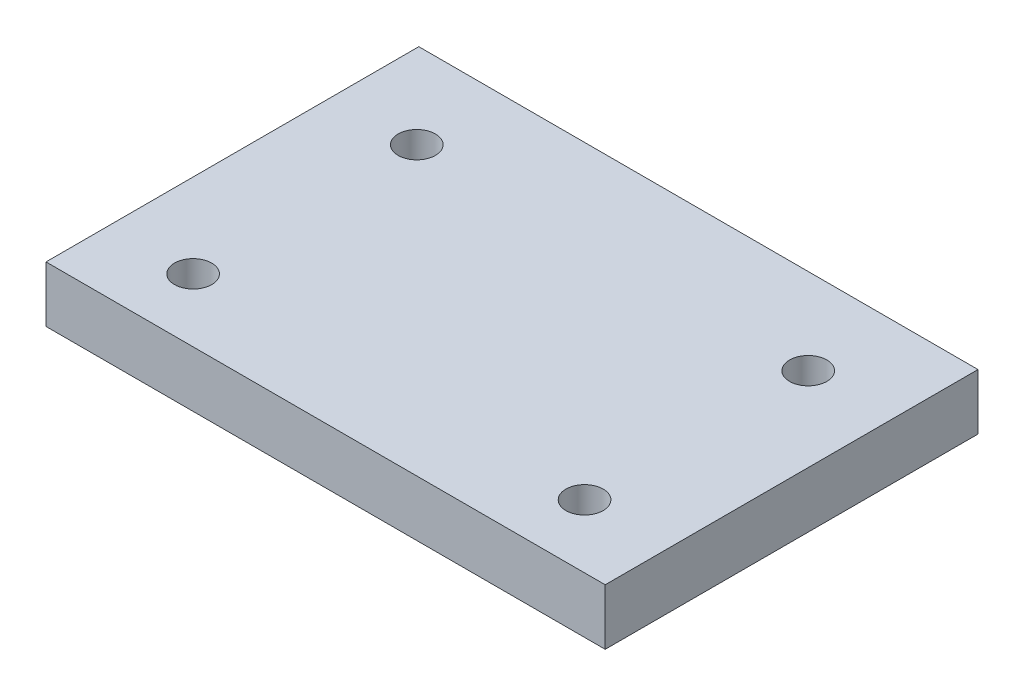
ISO-10303-21;
HEADER;
FILE_DESCRIPTION(('STEP AP214'),'2;1');
FILE_NAME('part.step','',(''),(''),'','','');
FILE_SCHEMA(('AUTOMOTIVE_DESIGN { 1 0 10303 214 1 1 1 1 }'));
ENDSEC;
DATA;
#1=APPLICATION_CONTEXT('core data for automotive mechanical design processes');
#2=APPLICATION_PROTOCOL_DEFINITION('international standard','automotive_design',2000,#1);
#3=PRODUCT_CONTEXT('',#1,'mechanical');
#4=PRODUCT('Part','Part','',(#3));
#5=PRODUCT_RELATED_PRODUCT_CATEGORY('part','',(#4));
#6=PRODUCT_DEFINITION_FORMATION('','',#4);
#7=PRODUCT_DEFINITION_CONTEXT('part definition',#1,'design');
#8=PRODUCT_DEFINITION('design','',#6,#7);
#9=PRODUCT_DEFINITION_SHAPE('','',#8);
#10=(LENGTH_UNIT() NAMED_UNIT(*) SI_UNIT(.MILLI.,.METRE.));
#11=(NAMED_UNIT(*) PLANE_ANGLE_UNIT() SI_UNIT($,.RADIAN.));
#12=(NAMED_UNIT(*) SI_UNIT($,.STERADIAN.) SOLID_ANGLE_UNIT());
#13=UNCERTAINTY_MEASURE_WITH_UNIT(LENGTH_MEASURE(1.E-05),#10,'distance_accuracy_value','');
#14=(GEOMETRIC_REPRESENTATION_CONTEXT(3) GLOBAL_UNCERTAINTY_ASSIGNED_CONTEXT((#13)) GLOBAL_UNIT_ASSIGNED_CONTEXT((#10,
#11,#12)) REPRESENTATION_CONTEXT('',''));
#15=CARTESIAN_POINT('',(0.,0.,0.));
#16=DIRECTION('',(0.,0.,1.));
#17=DIRECTION('',(1.,0.,0.));
#18=AXIS2_PLACEMENT_3D('',#15,#16,#17);
#19=CARTESIAN_POINT('',(0.,3.,0.));
#20=DIRECTION('',(0.,-1.,0.));
#21=DIRECTION('',(0.,0.,-1.));
#22=AXIS2_PLACEMENT_3D('',#19,#20,#21);
#23=PLANE('',#22);
#24=DIRECTION('',(0.,0.,1.));
#25=VECTOR('',#24,1.);
#26=CARTESIAN_POINT('',(0.,3.,0.));
#27=LINE('',#26,#25);
#28=CARTESIAN_POINT('',(0.,3.,-20.));
#29=VERTEX_POINT('',#28);
#30=CARTESIAN_POINT('',(0.,3.,0.));
#31=VERTEX_POINT('',#30);
#32=EDGE_CURVE('E92',#29,#31,#27,.T.);
#33=ORIENTED_EDGE('',*,*,#32,.T.);
#34=DIRECTION('',(1.,0.,0.));
#35=VECTOR('',#34,1.);
#36=CARTESIAN_POINT('',(0.,3.,0.));
#37=LINE('',#36,#35);
#38=CARTESIAN_POINT('',(30.,3.,0.));
#39=VERTEX_POINT('',#38);
#40=EDGE_CURVE('E87',#31,#39,#37,.T.);
#41=ORIENTED_EDGE('',*,*,#40,.T.);
#42=DIRECTION('',(0.,0.,-1.));
#43=VECTOR('',#42,1.);
#44=CARTESIAN_POINT('',(30.,3.,0.));
#45=LINE('',#44,#43);
#46=CARTESIAN_POINT('',(30.,3.,-20.));
#47=VERTEX_POINT('',#46);
#48=EDGE_CURVE('E90',#39,#47,#45,.T.);
#49=ORIENTED_EDGE('',*,*,#48,.T.);
#50=DIRECTION('',(-1.,0.,0.));
#51=VECTOR('',#50,1.);
#52=CARTESIAN_POINT('',(0.,3.,-20.));
#53=LINE('',#52,#51);
#54=EDGE_CURVE('E57',#47,#29,#53,.T.);
#55=ORIENTED_EDGE('',*,*,#54,.T.);
#56=EDGE_LOOP('',(#33,#41,#49,#55));
#57=FACE_BOUND('',#56,.T.);
#58=CARTESIAN_POINT('',(4.5,3.,-3.39212734361249));
#59=DIRECTION('',(0.,1.,0.));
#60=DIRECTION('',(0.,0.,1.));
#61=AXIS2_PLACEMENT_3D('',#58,#59,#60);
#62=CIRCLE('',#61,1.);
#63=CARTESIAN_POINT('',(4.5,3.,-2.39212734361249));
#64=VERTEX_POINT('',#63);
#65=EDGE_CURVE('E112',#64,#64,#62,.T.);
#66=ORIENTED_EDGE('',*,*,#65,.F.);
#67=EDGE_LOOP('',(#66));
#68=FACE_BOUND('',#67,.T.);
#69=CARTESIAN_POINT('',(25.5,3.,-3.39212734361249));
#70=DIRECTION('',(0.,1.,0.));
#71=DIRECTION('',(0.,0.,1.));
#72=AXIS2_PLACEMENT_3D('',#69,#70,#71);
#73=CIRCLE('',#72,1.);
#74=CARTESIAN_POINT('',(25.5,3.,-2.39212734361249));
#75=VERTEX_POINT('',#74);
#76=EDGE_CURVE('E134',#75,#75,#73,.T.);
#77=ORIENTED_EDGE('',*,*,#76,.F.);
#78=EDGE_LOOP('',(#77));
#79=FACE_BOUND('',#78,.T.);
#80=CARTESIAN_POINT('',(25.5,3.,-15.3921273436125));
#81=DIRECTION('',(0.,1.,0.));
#82=DIRECTION('',(0.,0.,1.));
#83=AXIS2_PLACEMENT_3D('',#80,#81,#82);
#84=CIRCLE('',#83,1.);
#85=CARTESIAN_POINT('',(25.5,3.,-14.3921273436125));
#86=VERTEX_POINT('',#85);
#87=EDGE_CURVE('E142',#86,#86,#84,.T.);
#88=ORIENTED_EDGE('',*,*,#87,.F.);
#89=EDGE_LOOP('',(#88));
#90=FACE_BOUND('',#89,.T.);
#91=CARTESIAN_POINT('',(4.5,3.,-15.3921273436125));
#92=DIRECTION('',(0.,1.,0.));
#93=DIRECTION('',(0.,0.,1.));
#94=AXIS2_PLACEMENT_3D('',#91,#92,#93);
#95=CIRCLE('',#94,1.);
#96=CARTESIAN_POINT('',(4.5,3.,-14.3921273436125));
#97=VERTEX_POINT('',#96);
#98=EDGE_CURVE('E150',#97,#97,#95,.T.);
#99=ORIENTED_EDGE('',*,*,#98,.F.);
#100=EDGE_LOOP('',(#99));
#101=FACE_BOUND('',#100,.T.);
#102=ADVANCED_FACE('F39',(#57,#68,#79,#90,#101),#23,.F.);
#103=CARTESIAN_POINT('',(0.,0.,0.));
#104=DIRECTION('',(0.,-1.,0.));
#105=DIRECTION('',(0.,0.,-1.));
#106=AXIS2_PLACEMENT_3D('',#103,#104,#105);
#107=PLANE('',#106);
#108=CARTESIAN_POINT('',(25.5,0.,-15.3921273436125));
#109=DIRECTION('',(0.,1.,0.));
#110=DIRECTION('',(0.,0.,1.));
#111=AXIS2_PLACEMENT_3D('',#108,#109,#110);
#112=CIRCLE('',#111,1.);
#113=CARTESIAN_POINT('',(25.5,0.,-14.3921273436125));
#114=VERTEX_POINT('',#113);
#115=EDGE_CURVE('E146',#114,#114,#112,.T.);
#116=ORIENTED_EDGE('',*,*,#115,.T.);
#117=EDGE_LOOP('',(#116));
#118=FACE_BOUND('',#117,.T.);
#119=CARTESIAN_POINT('',(4.5,0.,-3.39212734361249));
#120=DIRECTION('',(0.,1.,0.));
#121=DIRECTION('',(0.,0.,1.));
#122=AXIS2_PLACEMENT_3D('',#119,#120,#121);
#123=CIRCLE('',#122,1.);
#124=CARTESIAN_POINT('',(4.5,0.,-2.39212734361249));
#125=VERTEX_POINT('',#124);
#126=EDGE_CURVE('E130',#125,#125,#123,.T.);
#127=ORIENTED_EDGE('',*,*,#126,.T.);
#128=EDGE_LOOP('',(#127));
#129=FACE_BOUND('',#128,.T.);
#130=DIRECTION('',(0.,0.,1.));
#131=VECTOR('',#130,1.);
#132=CARTESIAN_POINT('',(0.,0.,0.));
#133=LINE('',#132,#131);
#134=CARTESIAN_POINT('',(0.,0.,-20.));
#135=VERTEX_POINT('',#134);
#136=CARTESIAN_POINT('',(0.,0.,0.));
#137=VERTEX_POINT('',#136);
#138=EDGE_CURVE('E108',#135,#137,#133,.T.);
#139=ORIENTED_EDGE('',*,*,#138,.F.);
#140=DIRECTION('',(-1.,0.,0.));
#141=VECTOR('',#140,1.);
#142=CARTESIAN_POINT('',(0.,0.,-20.));
#143=LINE('',#142,#141);
#144=CARTESIAN_POINT('',(30.,0.,-20.));
#145=VERTEX_POINT('',#144);
#146=EDGE_CURVE('E80',#145,#135,#143,.T.);
#147=ORIENTED_EDGE('',*,*,#146,.F.);
#148=DIRECTION('',(0.,0.,-1.));
#149=VECTOR('',#148,1.);
#150=CARTESIAN_POINT('',(30.,0.,0.));
#151=LINE('',#150,#149);
#152=CARTESIAN_POINT('',(30.,0.,0.));
#153=VERTEX_POINT('',#152);
#154=EDGE_CURVE('E74',#153,#145,#151,.T.);
#155=ORIENTED_EDGE('',*,*,#154,.F.);
#156=DIRECTION('',(1.,0.,0.));
#157=VECTOR('',#156,1.);
#158=CARTESIAN_POINT('',(0.,0.,0.));
#159=LINE('',#158,#157);
#160=EDGE_CURVE('E97',#137,#153,#159,.T.);
#161=ORIENTED_EDGE('',*,*,#160,.F.);
#162=EDGE_LOOP('',(#139,#147,#155,#161));
#163=FACE_BOUND('',#162,.T.);
#164=CARTESIAN_POINT('',(25.5,0.,-3.39212734361249));
#165=DIRECTION('',(0.,1.,0.));
#166=DIRECTION('',(0.,0.,1.));
#167=AXIS2_PLACEMENT_3D('',#164,#165,#166);
#168=CIRCLE('',#167,1.);
#169=CARTESIAN_POINT('',(25.5,0.,-2.39212734361249));
#170=VERTEX_POINT('',#169);
#171=EDGE_CURVE('E138',#170,#170,#168,.T.);
#172=ORIENTED_EDGE('',*,*,#171,.T.);
#173=EDGE_LOOP('',(#172));
#174=FACE_BOUND('',#173,.T.);
#175=CARTESIAN_POINT('',(4.5,0.,-15.3921273436125));
#176=DIRECTION('',(0.,1.,0.));
#177=DIRECTION('',(0.,0.,1.));
#178=AXIS2_PLACEMENT_3D('',#175,#176,#177);
#179=CIRCLE('',#178,1.);
#180=CARTESIAN_POINT('',(4.5,0.,-14.3921273436125));
#181=VERTEX_POINT('',#180);
#182=EDGE_CURVE('E154',#181,#181,#179,.T.);
#183=ORIENTED_EDGE('',*,*,#182,.T.);
#184=EDGE_LOOP('',(#183));
#185=FACE_BOUND('',#184,.T.);
#186=ADVANCED_FACE('F125',(#118,#129,#163,#174,#185),#107,.T.);
#187=CARTESIAN_POINT('',(0.,3.,0.));
#188=DIRECTION('',(1.,0.,0.));
#189=DIRECTION('',(0.,0.,-1.));
#190=AXIS2_PLACEMENT_3D('',#187,#188,#189);
#191=PLANE('',#190);
#192=ORIENTED_EDGE('',*,*,#138,.T.);
#193=DIRECTION('',(0.,-1.,0.));
#194=VECTOR('',#193,1.);
#195=CARTESIAN_POINT('',(0.,3.,0.));
#196=LINE('',#195,#194);
#197=EDGE_CURVE('E11',#31,#137,#196,.T.);
#198=ORIENTED_EDGE('',*,*,#197,.F.);
#199=ORIENTED_EDGE('',*,*,#32,.F.);
#200=DIRECTION('',(0.,-1.,0.));
#201=VECTOR('',#200,1.);
#202=CARTESIAN_POINT('',(0.,3.,-20.));
#203=LINE('',#202,#201);
#204=EDGE_CURVE('E104',#29,#135,#203,.T.);
#205=ORIENTED_EDGE('',*,*,#204,.T.);
#206=EDGE_LOOP('',(#192,#198,#199,#205));
#207=FACE_BOUND('',#206,.T.);
#208=ADVANCED_FACE('F41',(#207),#191,.F.);
#209=CARTESIAN_POINT('',(0.,3.,0.));
#210=DIRECTION('',(0.,0.,-1.));
#211=DIRECTION('',(-1.,0.,0.));
#212=AXIS2_PLACEMENT_3D('',#209,#210,#211);
#213=PLANE('',#212);
#214=ORIENTED_EDGE('',*,*,#160,.T.);
#215=DIRECTION('',(0.,-1.,0.));
#216=VECTOR('',#215,1.);
#217=CARTESIAN_POINT('',(30.,3.,0.));
#218=LINE('',#217,#216);
#219=EDGE_CURVE('E49',#39,#153,#218,.T.);
#220=ORIENTED_EDGE('',*,*,#219,.F.);
#221=ORIENTED_EDGE('',*,*,#40,.F.);
#222=ORIENTED_EDGE('',*,*,#197,.T.);
#223=EDGE_LOOP('',(#214,#220,#221,#222));
#224=FACE_BOUND('',#223,.T.);
#225=ADVANCED_FACE('F96',(#224),#213,.F.);
#226=CARTESIAN_POINT('',(30.,3.,0.));
#227=DIRECTION('',(-1.,0.,0.));
#228=DIRECTION('',(0.,0.,1.));
#229=AXIS2_PLACEMENT_3D('',#226,#227,#228);
#230=PLANE('',#229);
#231=ORIENTED_EDGE('',*,*,#154,.T.);
#232=DIRECTION('',(0.,-1.,0.));
#233=VECTOR('',#232,1.);
#234=CARTESIAN_POINT('',(30.,3.,-20.));
#235=LINE('',#234,#233);
#236=EDGE_CURVE('E99',#47,#145,#235,.T.);
#237=ORIENTED_EDGE('',*,*,#236,.F.);
#238=ORIENTED_EDGE('',*,*,#48,.F.);
#239=ORIENTED_EDGE('',*,*,#219,.T.);
#240=EDGE_LOOP('',(#231,#237,#238,#239));
#241=FACE_BOUND('',#240,.T.);
#242=ADVANCED_FACE('F100',(#241),#230,.F.);
#243=CARTESIAN_POINT('',(0.,3.,-20.));
#244=DIRECTION('',(0.,0.,1.));
#245=DIRECTION('',(1.,0.,0.));
#246=AXIS2_PLACEMENT_3D('',#243,#244,#245);
#247=PLANE('',#246);
#248=ORIENTED_EDGE('',*,*,#146,.T.);
#249=ORIENTED_EDGE('',*,*,#204,.F.);
#250=ORIENTED_EDGE('',*,*,#54,.F.);
#251=ORIENTED_EDGE('',*,*,#236,.T.);
#252=EDGE_LOOP('',(#248,#249,#250,#251));
#253=FACE_BOUND('',#252,.T.);
#254=ADVANCED_FACE('F122',(#253),#247,.F.);
#255=CARTESIAN_POINT('',(4.5,3.,-3.39212734361249));
#256=DIRECTION('',(0.,-1.,0.));
#257=DIRECTION('',(0.,0.,-1.));
#258=AXIS2_PLACEMENT_3D('',#255,#256,#257);
#259=CYLINDRICAL_SURFACE('',#258,1.);
#260=ORIENTED_EDGE('',*,*,#65,.T.);
#261=EDGE_LOOP('',(#260));
#262=FACE_BOUND('',#261,.T.);
#263=ORIENTED_EDGE('',*,*,#126,.F.);
#264=EDGE_LOOP('',(#263));
#265=FACE_BOUND('',#264,.T.);
#266=ADVANCED_FACE('F173',(#262,#265),#259,.F.);
#267=CARTESIAN_POINT('',(25.5,3.,-3.39212734361249));
#268=DIRECTION('',(0.,-1.,0.));
#269=DIRECTION('',(0.,0.,-1.));
#270=AXIS2_PLACEMENT_3D('',#267,#268,#269);
#271=CYLINDRICAL_SURFACE('',#270,1.);
#272=ORIENTED_EDGE('',*,*,#76,.T.);
#273=EDGE_LOOP('',(#272));
#274=FACE_BOUND('',#273,.T.);
#275=ORIENTED_EDGE('',*,*,#171,.F.);
#276=EDGE_LOOP('',(#275));
#277=FACE_BOUND('',#276,.T.);
#278=ADVANCED_FACE('F219',(#274,#277),#271,.F.);
#279=CARTESIAN_POINT('',(25.5,3.,-15.3921273436125));
#280=DIRECTION('',(0.,-1.,0.));
#281=DIRECTION('',(0.,0.,-1.));
#282=AXIS2_PLACEMENT_3D('',#279,#280,#281);
#283=CYLINDRICAL_SURFACE('',#282,1.);
#284=ORIENTED_EDGE('',*,*,#87,.T.);
#285=EDGE_LOOP('',(#284));
#286=FACE_BOUND('',#285,.T.);
#287=ORIENTED_EDGE('',*,*,#115,.F.);
#288=EDGE_LOOP('',(#287));
#289=FACE_BOUND('',#288,.T.);
#290=ADVANCED_FACE('F227',(#286,#289),#283,.F.);
#291=CARTESIAN_POINT('',(4.5,3.,-15.3921273436125));
#292=DIRECTION('',(0.,-1.,0.));
#293=DIRECTION('',(0.,0.,-1.));
#294=AXIS2_PLACEMENT_3D('',#291,#292,#293);
#295=CYLINDRICAL_SURFACE('',#294,1.);
#296=ORIENTED_EDGE('',*,*,#98,.T.);
#297=EDGE_LOOP('',(#296));
#298=FACE_BOUND('',#297,.T.);
#299=ORIENTED_EDGE('',*,*,#182,.F.);
#300=EDGE_LOOP('',(#299));
#301=FACE_BOUND('',#300,.T.);
#302=ADVANCED_FACE('F162',(#298,#301),#295,.F.);
#303=CLOSED_SHELL('',(#102,#186,#208,#225,#242,#254,#266,#278,#290,#302));
#304=MANIFOLD_SOLID_BREP('B2',#303);
#305=ADVANCED_BREP_SHAPE_REPRESENTATION('',(#18,#304),#14);
#306=SHAPE_DEFINITION_REPRESENTATION(#9,#305);
ENDSEC;
END-ISO-10303-21;
